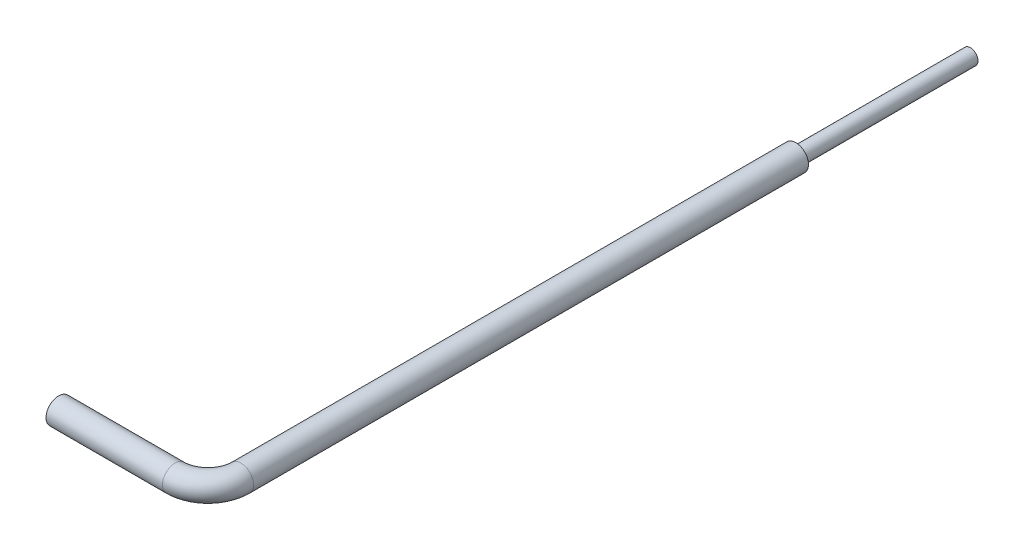
ISO-10303-21;
HEADER;
FILE_DESCRIPTION(('STEP AP214'),'2;1');
FILE_NAME('part.step','',(''),(''),'','','');
FILE_SCHEMA(('AUTOMOTIVE_DESIGN { 1 0 10303 214 1 1 1 1 }'));
ENDSEC;
DATA;
#1=APPLICATION_CONTEXT('core data for automotive mechanical design processes');
#2=APPLICATION_PROTOCOL_DEFINITION('international standard','automotive_design',2000,#1);
#3=PRODUCT_CONTEXT('',#1,'mechanical');
#4=PRODUCT('Part','Part','',(#3));
#5=PRODUCT_RELATED_PRODUCT_CATEGORY('part','',(#4));
#6=PRODUCT_DEFINITION_FORMATION('','',#4);
#7=PRODUCT_DEFINITION_CONTEXT('part definition',#1,'design');
#8=PRODUCT_DEFINITION('design','',#6,#7);
#9=PRODUCT_DEFINITION_SHAPE('','',#8);
#10=(LENGTH_UNIT() NAMED_UNIT(*) SI_UNIT(.MILLI.,.METRE.));
#11=(NAMED_UNIT(*) PLANE_ANGLE_UNIT() SI_UNIT($,.RADIAN.));
#12=(NAMED_UNIT(*) SI_UNIT($,.STERADIAN.) SOLID_ANGLE_UNIT());
#13=UNCERTAINTY_MEASURE_WITH_UNIT(LENGTH_MEASURE(1.E-05),#10,'distance_accuracy_value','');
#14=(GEOMETRIC_REPRESENTATION_CONTEXT(3) GLOBAL_UNCERTAINTY_ASSIGNED_CONTEXT((#13)) GLOBAL_UNIT_ASSIGNED_CONTEXT((#10,
#11,#12)) REPRESENTATION_CONTEXT('',''));
#15=CARTESIAN_POINT('',(0.,0.,0.));
#16=DIRECTION('',(0.,0.,1.));
#17=DIRECTION('',(1.,0.,0.));
#18=AXIS2_PLACEMENT_3D('',#15,#16,#17);
#19=CARTESIAN_POINT('',(39.84,-0.535,-3.8));
#20=DIRECTION('',(-1.,0.,0.));
#21=DIRECTION('',(0.,0.,1.));
#22=AXIS2_PLACEMENT_3D('',#19,#20,#21);
#23=PLANE('',#22);
#24=CARTESIAN_POINT('',(39.84,-0.535,-3.8));
#25=DIRECTION('',(-1.,0.,0.));
#26=DIRECTION('',(0.,0.,1.));
#27=AXIS2_PLACEMENT_3D('',#24,#25,#26);
#28=CIRCLE('',#27,0.435);
#29=CARTESIAN_POINT('',(39.84,-0.535,-3.365));
#30=VERTEX_POINT('',#29);
#31=EDGE_CURVE('E18',#30,#30,#28,.F.);
#32=ORIENTED_EDGE('',*,*,#31,.F.);
#33=EDGE_LOOP('',(#32));
#34=FACE_BOUND('',#33,.T.);
#35=ADVANCED_FACE('F15',(#34),#23,.T.);
#36=CARTESIAN_POINT('',(41.84,-0.535,-3.8));
#37=DIRECTION('',(-1.,0.,0.));
#38=DIRECTION('',(0.,0.,1.));
#39=AXIS2_PLACEMENT_3D('',#36,#37,#38);
#40=CYLINDRICAL_SURFACE('',#39,0.435);
#41=CARTESIAN_POINT('',(43.84,-0.535,-3.8));
#42=DIRECTION('',(-1.,0.,0.));
#43=DIRECTION('',(0.,0.,1.));
#44=AXIS2_PLACEMENT_3D('',#41,#42,#43);
#45=CIRCLE('',#44,0.435);
#46=CARTESIAN_POINT('',(43.84,-0.535,-3.365));
#47=VERTEX_POINT('',#46);
#48=EDGE_CURVE('E30',#47,#47,#45,.F.);
#49=ORIENTED_EDGE('',*,*,#48,.F.);
#50=EDGE_LOOP('',(#49));
#51=FACE_BOUND('',#50,.T.);
#52=ORIENTED_EDGE('',*,*,#31,.T.);
#53=EDGE_LOOP('',(#52));
#54=FACE_BOUND('',#53,.T.);
#55=ADVANCED_FACE('F44',(#51,#54),#40,.T.);
#56=CARTESIAN_POINT('',(44.971,-0.535,-30.));
#57=DIRECTION('',(0.,0.,-1.));
#58=DIRECTION('',(-1.,0.,0.));
#59=AXIS2_PLACEMENT_3D('',#56,#57,#58);
#60=PLANE('',#59);
#61=CARTESIAN_POINT('',(44.971,-0.535,-30.));
#62=DIRECTION('',(0.,0.,-1.));
#63=DIRECTION('',(-1.,0.,0.));
#64=AXIS2_PLACEMENT_3D('',#61,#62,#63);
#65=CIRCLE('',#64,0.261);
#66=CARTESIAN_POINT('',(44.71,-0.535,-30.));
#67=VERTEX_POINT('',#66);
#68=EDGE_CURVE('E32',#67,#67,#65,.F.);
#69=ORIENTED_EDGE('',*,*,#68,.F.);
#70=EDGE_LOOP('',(#69));
#71=FACE_BOUND('',#70,.T.);
#72=ADVANCED_FACE('F51',(#71),#60,.T.);
#73=CARTESIAN_POINT('',(43.84,-0.535,-4.931));
#74=DIRECTION('',(0.,-1.,0.));
#75=DIRECTION('',(0.,0.,-1.));
#76=AXIS2_PLACEMENT_3D('',#73,#74,#75);
#77=TOROIDAL_SURFACE('',#76,1.131,0.435);
#78=CARTESIAN_POINT('',(44.971,-0.535,-4.931));
#79=DIRECTION('',(0.,0.,-1.));
#80=DIRECTION('',(-1.,0.,0.));
#81=AXIS2_PLACEMENT_3D('',#78,#79,#80);
#82=CIRCLE('',#81,0.435);
#83=CARTESIAN_POINT('',(44.536,-0.535,-4.931));
#84=VERTEX_POINT('',#83);
#85=EDGE_CURVE('E27',#84,#84,#82,.T.);
#86=ORIENTED_EDGE('',*,*,#85,.F.);
#87=EDGE_LOOP('',(#86));
#88=FACE_BOUND('',#87,.T.);
#89=ORIENTED_EDGE('',*,*,#48,.T.);
#90=EDGE_LOOP('',(#89));
#91=FACE_BOUND('',#90,.T.);
#92=ADVANCED_FACE('F67',(#88,#91),#77,.T.);
#93=CARTESIAN_POINT('',(44.971,-0.535,-27.));
#94=DIRECTION('',(0.,0.,-1.));
#95=DIRECTION('',(-1.,0.,0.));
#96=AXIS2_PLACEMENT_3D('',#93,#94,#95);
#97=CYLINDRICAL_SURFACE('',#96,0.261);
#98=CARTESIAN_POINT('',(44.971,-0.535,-24.));
#99=DIRECTION('',(0.,0.,-1.));
#100=DIRECTION('',(-1.,0.,0.));
#101=AXIS2_PLACEMENT_3D('',#98,#99,#100);
#102=CIRCLE('',#101,0.261);
#103=CARTESIAN_POINT('',(44.71,-0.535,-24.));
#104=VERTEX_POINT('',#103);
#105=EDGE_CURVE('E22',#104,#104,#102,.F.);
#106=ORIENTED_EDGE('',*,*,#105,.F.);
#107=EDGE_LOOP('',(#106));
#108=FACE_BOUND('',#107,.T.);
#109=ORIENTED_EDGE('',*,*,#68,.T.);
#110=EDGE_LOOP('',(#109));
#111=FACE_BOUND('',#110,.T.);
#112=ADVANCED_FACE('F61',(#108,#111),#97,.T.);
#113=CARTESIAN_POINT('',(44.971,-0.535,-24.));
#114=DIRECTION('',(0.,0.,-1.));
#115=DIRECTION('',(-1.,0.,0.));
#116=AXIS2_PLACEMENT_3D('',#113,#114,#115);
#117=PLANE('',#116);
#118=ORIENTED_EDGE('',*,*,#105,.T.);
#119=EDGE_LOOP('',(#118));
#120=FACE_BOUND('',#119,.T.);
#121=CARTESIAN_POINT('',(44.971,-0.535,-24.));
#122=DIRECTION('',(0.,0.,-1.));
#123=DIRECTION('',(-1.,0.,0.));
#124=AXIS2_PLACEMENT_3D('',#121,#122,#123);
#125=CIRCLE('',#124,0.435);
#126=CARTESIAN_POINT('',(44.536,-0.535,-24.));
#127=VERTEX_POINT('',#126);
#128=EDGE_CURVE('E10',#127,#127,#125,.F.);
#129=ORIENTED_EDGE('',*,*,#128,.F.);
#130=EDGE_LOOP('',(#129));
#131=FACE_BOUND('',#130,.T.);
#132=ADVANCED_FACE('F55',(#120,#131),#117,.T.);
#133=CARTESIAN_POINT('',(44.971,-0.535,-8.4655));
#134=DIRECTION('',(0.,0.,-1.));
#135=DIRECTION('',(-1.,0.,0.));
#136=AXIS2_PLACEMENT_3D('',#133,#134,#135);
#137=CYLINDRICAL_SURFACE('',#136,0.435);
#138=ORIENTED_EDGE('',*,*,#85,.T.);
#139=EDGE_LOOP('',(#138));
#140=FACE_BOUND('',#139,.T.);
#141=ORIENTED_EDGE('',*,*,#128,.T.);
#142=EDGE_LOOP('',(#141));
#143=FACE_BOUND('',#142,.T.);
#144=ADVANCED_FACE('F53',(#140,#143),#137,.T.);
#145=CLOSED_SHELL('',(#35,#55,#72,#92,#112,#132,#144));
#146=MANIFOLD_SOLID_BREP('B1',#145);
#147=ADVANCED_BREP_SHAPE_REPRESENTATION('',(#18,#146),#14);
#148=SHAPE_DEFINITION_REPRESENTATION(#9,#147);
ENDSEC;
END-ISO-10303-21;
